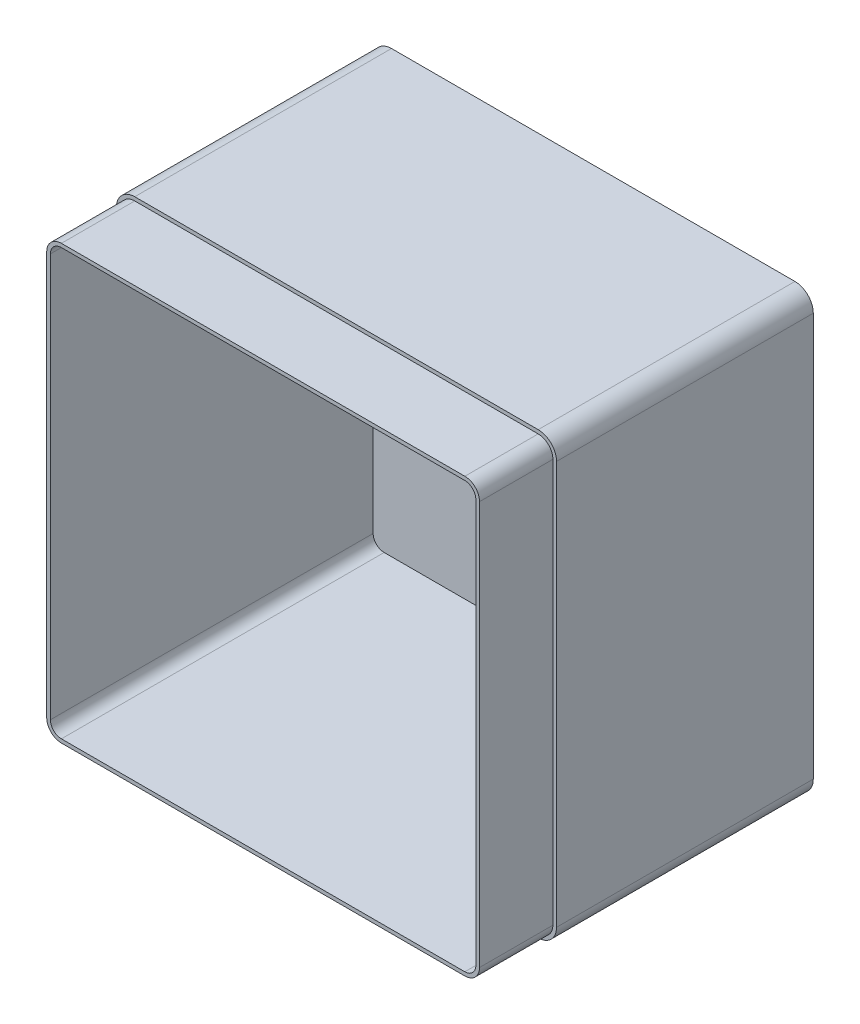
ISO-10303-21;
HEADER;
FILE_DESCRIPTION(('STEP AP214'),'2;1');
FILE_NAME('part.step','',(''),(''),'','','');
FILE_SCHEMA(('AUTOMOTIVE_DESIGN { 1 0 10303 214 1 1 1 1 }'));
ENDSEC;
DATA;
#1=APPLICATION_CONTEXT('core data for automotive mechanical design processes');
#2=APPLICATION_PROTOCOL_DEFINITION('international standard','automotive_design',2000,#1);
#3=PRODUCT_CONTEXT('',#1,'mechanical');
#4=PRODUCT('Part','Part','',(#3));
#5=PRODUCT_RELATED_PRODUCT_CATEGORY('part','',(#4));
#6=PRODUCT_DEFINITION_FORMATION('','',#4);
#7=PRODUCT_DEFINITION_CONTEXT('part definition',#1,'design');
#8=PRODUCT_DEFINITION('design','',#6,#7);
#9=PRODUCT_DEFINITION_SHAPE('','',#8);
#10=(LENGTH_UNIT() NAMED_UNIT(*) SI_UNIT(.MILLI.,.METRE.));
#11=(NAMED_UNIT(*) PLANE_ANGLE_UNIT() SI_UNIT($,.RADIAN.));
#12=(NAMED_UNIT(*) SI_UNIT($,.STERADIAN.) SOLID_ANGLE_UNIT());
#13=UNCERTAINTY_MEASURE_WITH_UNIT(LENGTH_MEASURE(1.E-05),#10,'distance_accuracy_value','');
#14=(GEOMETRIC_REPRESENTATION_CONTEXT(3) GLOBAL_UNCERTAINTY_ASSIGNED_CONTEXT((#13)) GLOBAL_UNIT_ASSIGNED_CONTEXT((#10,
#11,#12)) REPRESENTATION_CONTEXT('',''));
#15=CARTESIAN_POINT('',(0.,0.,0.));
#16=DIRECTION('',(0.,0.,1.));
#17=DIRECTION('',(1.,0.,0.));
#18=AXIS2_PLACEMENT_3D('',#15,#16,#17);
#19=CARTESIAN_POINT('',(0.,0.,90.));
#20=DIRECTION('',(0.,0.,-1.));
#21=DIRECTION('',(-1.,0.,0.));
#22=AXIS2_PLACEMENT_3D('',#19,#20,#21);
#23=PLANE('',#22);
#24=DIRECTION('',(0.,-1.,0.));
#25=VECTOR('',#24,1.);
#26=CARTESIAN_POINT('',(2.,0.,90.));
#27=LINE('',#26,#25);
#28=CARTESIAN_POINT('',(2.,115.,90.));
#29=VERTEX_POINT('',#28);
#30=CARTESIAN_POINT('',(2.,5.,90.));
#31=VERTEX_POINT('',#30);
#32=EDGE_CURVE('E361',#29,#31,#27,.T.);
#33=ORIENTED_EDGE('',*,*,#32,.F.);
#34=CARTESIAN_POINT('',(5.,115.,90.));
#35=DIRECTION('',(0.,0.,-1.));
#36=DIRECTION('',(-1.,0.,0.));
#37=AXIS2_PLACEMENT_3D('',#34,#35,#36);
#38=CIRCLE('',#37,3.);
#39=CARTESIAN_POINT('',(5.,118.,90.));
#40=VERTEX_POINT('',#39);
#41=EDGE_CURVE('E407',#40,#29,#38,.F.);
#42=ORIENTED_EDGE('',*,*,#41,.F.);
#43=DIRECTION('',(-1.,0.,0.));
#44=VECTOR('',#43,1.);
#45=CARTESIAN_POINT('',(0.,118.,90.));
#46=LINE('',#45,#44);
#47=CARTESIAN_POINT('',(115.,118.,90.));
#48=VERTEX_POINT('',#47);
#49=EDGE_CURVE('E376',#48,#40,#46,.T.);
#50=ORIENTED_EDGE('',*,*,#49,.F.);
#51=CARTESIAN_POINT('',(115.,115.,90.));
#52=DIRECTION('',(0.,0.,-1.));
#53=DIRECTION('',(-1.,0.,0.));
#54=AXIS2_PLACEMENT_3D('',#51,#52,#53);
#55=CIRCLE('',#54,3.);
#56=CARTESIAN_POINT('',(118.,115.,90.));
#57=VERTEX_POINT('',#56);
#58=EDGE_CURVE('E340',#57,#48,#55,.F.);
#59=ORIENTED_EDGE('',*,*,#58,.F.);
#60=DIRECTION('',(0.,1.,0.));
#61=VECTOR('',#60,1.);
#62=CARTESIAN_POINT('',(118.,0.,90.));
#63=LINE('',#62,#61);
#64=CARTESIAN_POINT('',(118.,4.99999999999999,90.));
#65=VERTEX_POINT('',#64);
#66=EDGE_CURVE('E404',#65,#57,#63,.T.);
#67=ORIENTED_EDGE('',*,*,#66,.F.);
#68=CARTESIAN_POINT('',(115.,5.,90.));
#69=DIRECTION('',(0.,0.,-1.));
#70=DIRECTION('',(-1.,0.,0.));
#71=AXIS2_PLACEMENT_3D('',#68,#69,#70);
#72=CIRCLE('',#71,3.);
#73=CARTESIAN_POINT('',(115.,2.,90.));
#74=VERTEX_POINT('',#73);
#75=EDGE_CURVE('E400',#74,#65,#72,.F.);
#76=ORIENTED_EDGE('',*,*,#75,.F.);
#77=DIRECTION('',(1.,0.,0.));
#78=VECTOR('',#77,1.);
#79=CARTESIAN_POINT('',(0.,2.,90.));
#80=LINE('',#79,#78);
#81=CARTESIAN_POINT('',(5.,2.,90.));
#82=VERTEX_POINT('',#81);
#83=EDGE_CURVE('E397',#82,#74,#80,.T.);
#84=ORIENTED_EDGE('',*,*,#83,.F.);
#85=CARTESIAN_POINT('',(5.,5.,90.));
#86=DIRECTION('',(0.,0.,-1.));
#87=DIRECTION('',(-1.,0.,0.));
#88=AXIS2_PLACEMENT_3D('',#85,#86,#87);
#89=CIRCLE('',#88,3.);
#90=EDGE_CURVE('E385',#31,#82,#89,.F.);
#91=ORIENTED_EDGE('',*,*,#90,.F.);
#92=EDGE_LOOP('',(#33,#42,#50,#59,#67,#76,#84,#91));
#93=FACE_BOUND('',#92,.T.);
#94=CARTESIAN_POINT('',(5.,115.,90.));
#95=DIRECTION('',(0.,0.,1.));
#96=DIRECTION('',(1.,0.,0.));
#97=AXIS2_PLACEMENT_3D('',#94,#95,#96);
#98=CIRCLE('',#97,4.);
#99=CARTESIAN_POINT('',(5.,119.,90.));
#100=VERTEX_POINT('',#99);
#101=CARTESIAN_POINT('',(1.,115.,90.));
#102=VERTEX_POINT('',#101);
#103=EDGE_CURVE('E268',#100,#102,#98,.T.);
#104=ORIENTED_EDGE('',*,*,#103,.T.);
#105=DIRECTION('',(0.,-1.,0.));
#106=VECTOR('',#105,1.);
#107=CARTESIAN_POINT('',(1.,115.,90.));
#108=LINE('',#107,#106);
#109=CARTESIAN_POINT('',(1.,4.99999999999999,90.));
#110=VERTEX_POINT('',#109);
#111=EDGE_CURVE('E218',#102,#110,#108,.T.);
#112=ORIENTED_EDGE('',*,*,#111,.T.);
#113=CARTESIAN_POINT('',(5.,5.,90.));
#114=DIRECTION('',(0.,0.,1.));
#115=DIRECTION('',(1.,0.,0.));
#116=AXIS2_PLACEMENT_3D('',#113,#114,#115);
#117=CIRCLE('',#116,4.);
#118=CARTESIAN_POINT('',(5.,1.,90.));
#119=VERTEX_POINT('',#118);
#120=EDGE_CURVE('E66',#110,#119,#117,.T.);
#121=ORIENTED_EDGE('',*,*,#120,.T.);
#122=DIRECTION('',(1.,0.,0.));
#123=VECTOR('',#122,1.);
#124=CARTESIAN_POINT('',(5.,1.,90.));
#125=LINE('',#124,#123);
#126=CARTESIAN_POINT('',(115.,1.,90.));
#127=VERTEX_POINT('',#126);
#128=EDGE_CURVE('E275',#119,#127,#125,.T.);
#129=ORIENTED_EDGE('',*,*,#128,.T.);
#130=CARTESIAN_POINT('',(115.,5.,90.));
#131=DIRECTION('',(0.,0.,1.));
#132=DIRECTION('',(1.,0.,0.));
#133=AXIS2_PLACEMENT_3D('',#130,#131,#132);
#134=CIRCLE('',#133,4.);
#135=CARTESIAN_POINT('',(119.,5.,90.));
#136=VERTEX_POINT('',#135);
#137=EDGE_CURVE('E279',#127,#136,#134,.T.);
#138=ORIENTED_EDGE('',*,*,#137,.T.);
#139=DIRECTION('',(0.,1.,0.));
#140=VECTOR('',#139,1.);
#141=CARTESIAN_POINT('',(119.,5.,90.));
#142=LINE('',#141,#140);
#143=CARTESIAN_POINT('',(119.,115.,90.));
#144=VERTEX_POINT('',#143);
#145=EDGE_CURVE('E283',#136,#144,#142,.T.);
#146=ORIENTED_EDGE('',*,*,#145,.T.);
#147=CARTESIAN_POINT('',(115.,115.,90.));
#148=DIRECTION('',(0.,0.,1.));
#149=DIRECTION('',(1.,0.,0.));
#150=AXIS2_PLACEMENT_3D('',#147,#148,#149);
#151=CIRCLE('',#150,4.);
#152=CARTESIAN_POINT('',(115.,119.,90.));
#153=VERTEX_POINT('',#152);
#154=EDGE_CURVE('E245',#144,#153,#151,.T.);
#155=ORIENTED_EDGE('',*,*,#154,.T.);
#156=DIRECTION('',(-1.,0.,0.));
#157=VECTOR('',#156,1.);
#158=CARTESIAN_POINT('',(115.,119.,90.));
#159=LINE('',#158,#157);
#160=EDGE_CURVE('E241',#153,#100,#159,.T.);
#161=ORIENTED_EDGE('',*,*,#160,.T.);
#162=EDGE_LOOP('',(#104,#112,#121,#129,#138,#146,#155,#161));
#163=FACE_BOUND('',#162,.T.);
#164=ADVANCED_FACE('F50',(#93,#163),#23,.F.);
#165=CARTESIAN_POINT('',(2.,0.,90.));
#166=DIRECTION('',(1.,0.,0.));
#167=DIRECTION('',(0.,0.,-1.));
#168=AXIS2_PLACEMENT_3D('',#165,#166,#167);
#169=PLANE('',#168);
#170=DIRECTION('',(0.,-1.,0.));
#171=VECTOR('',#170,1.);
#172=CARTESIAN_POINT('',(2.,0.,2.));
#173=LINE('',#172,#171);
#174=CARTESIAN_POINT('',(2.,115.,2.));
#175=VERTEX_POINT('',#174);
#176=CARTESIAN_POINT('',(2.,5.,2.));
#177=VERTEX_POINT('',#176);
#178=EDGE_CURVE('E332',#175,#177,#173,.T.);
#179=ORIENTED_EDGE('',*,*,#178,.F.);
#180=DIRECTION('',(0.,0.,-1.));
#181=VECTOR('',#180,1.);
#182=CARTESIAN_POINT('',(2.,115.,90.));
#183=LINE('',#182,#181);
#184=EDGE_CURVE('E341',#29,#175,#183,.T.);
#185=ORIENTED_EDGE('',*,*,#184,.F.);
#186=ORIENTED_EDGE('',*,*,#32,.T.);
#187=DIRECTION('',(0.,0.,-1.));
#188=VECTOR('',#187,1.);
#189=CARTESIAN_POINT('',(2.,5.,90.));
#190=LINE('',#189,#188);
#191=EDGE_CURVE('E337',#177,#31,#190,.F.);
#192=ORIENTED_EDGE('',*,*,#191,.F.);
#193=EDGE_LOOP('',(#179,#185,#186,#192));
#194=FACE_BOUND('',#193,.T.);
#195=ADVANCED_FACE('F515',(#194),#169,.T.);
#196=CARTESIAN_POINT('',(0.,2.,90.));
#197=DIRECTION('',(0.,1.,0.));
#198=DIRECTION('',(0.,0.,1.));
#199=AXIS2_PLACEMENT_3D('',#196,#197,#198);
#200=PLANE('',#199);
#201=ORIENTED_EDGE('',*,*,#83,.T.);
#202=DIRECTION('',(0.,0.,1.));
#203=VECTOR('',#202,1.);
#204=CARTESIAN_POINT('',(115.,2.,90.));
#205=LINE('',#204,#203);
#206=CARTESIAN_POINT('',(115.,2.,2.));
#207=VERTEX_POINT('',#206);
#208=EDGE_CURVE('E373',#207,#74,#205,.T.);
#209=ORIENTED_EDGE('',*,*,#208,.F.);
#210=DIRECTION('',(1.,0.,0.));
#211=VECTOR('',#210,1.);
#212=CARTESIAN_POINT('',(0.,2.,2.));
#213=LINE('',#212,#211);
#214=CARTESIAN_POINT('',(5.,2.,2.));
#215=VERTEX_POINT('',#214);
#216=EDGE_CURVE('E336',#215,#207,#213,.T.);
#217=ORIENTED_EDGE('',*,*,#216,.F.);
#218=DIRECTION('',(0.,0.,1.));
#219=VECTOR('',#218,1.);
#220=CARTESIAN_POINT('',(5.,2.,90.));
#221=LINE('',#220,#219);
#222=EDGE_CURVE('E364',#82,#215,#221,.F.);
#223=ORIENTED_EDGE('',*,*,#222,.F.);
#224=EDGE_LOOP('',(#201,#209,#217,#223));
#225=FACE_BOUND('',#224,.T.);
#226=ADVANCED_FACE('F521',(#225),#200,.T.);
#227=CARTESIAN_POINT('',(118.,0.,90.));
#228=DIRECTION('',(-1.,0.,0.));
#229=DIRECTION('',(0.,0.,1.));
#230=AXIS2_PLACEMENT_3D('',#227,#228,#229);
#231=PLANE('',#230);
#232=ORIENTED_EDGE('',*,*,#66,.T.);
#233=DIRECTION('',(0.,0.,1.));
#234=VECTOR('',#233,1.);
#235=CARTESIAN_POINT('',(118.,115.,90.));
#236=LINE('',#235,#234);
#237=CARTESIAN_POINT('',(118.,115.,2.));
#238=VERTEX_POINT('',#237);
#239=EDGE_CURVE('E382',#238,#57,#236,.T.);
#240=ORIENTED_EDGE('',*,*,#239,.F.);
#241=DIRECTION('',(0.,1.,0.));
#242=VECTOR('',#241,1.);
#243=CARTESIAN_POINT('',(118.,0.,2.));
#244=LINE('',#243,#242);
#245=CARTESIAN_POINT('',(118.,4.99999999999999,2.));
#246=VERTEX_POINT('',#245);
#247=EDGE_CURVE('E349',#246,#238,#244,.T.);
#248=ORIENTED_EDGE('',*,*,#247,.F.);
#249=DIRECTION('',(0.,0.,1.));
#250=VECTOR('',#249,1.);
#251=CARTESIAN_POINT('',(118.,4.99999999999999,90.));
#252=LINE('',#251,#250);
#253=EDGE_CURVE('E377',#65,#246,#252,.F.);
#254=ORIENTED_EDGE('',*,*,#253,.F.);
#255=EDGE_LOOP('',(#232,#240,#248,#254));
#256=FACE_BOUND('',#255,.T.);
#257=ADVANCED_FACE('F737',(#256),#231,.T.);
#258=CARTESIAN_POINT('',(0.,118.,90.));
#259=DIRECTION('',(0.,-1.,0.));
#260=DIRECTION('',(0.,0.,-1.));
#261=AXIS2_PLACEMENT_3D('',#258,#259,#260);
#262=PLANE('',#261);
#263=DIRECTION('',(-1.,0.,0.));
#264=VECTOR('',#263,1.);
#265=CARTESIAN_POINT('',(0.,118.,2.));
#266=LINE('',#265,#264);
#267=CARTESIAN_POINT('',(115.,118.,2.));
#268=VERTEX_POINT('',#267);
#269=CARTESIAN_POINT('',(5.,118.,2.));
#270=VERTEX_POINT('',#269);
#271=EDGE_CURVE('E357',#268,#270,#266,.T.);
#272=ORIENTED_EDGE('',*,*,#271,.F.);
#273=DIRECTION('',(0.,0.,-1.));
#274=VECTOR('',#273,1.);
#275=CARTESIAN_POINT('',(115.,118.,90.));
#276=LINE('',#275,#274);
#277=EDGE_CURVE('E381',#48,#268,#276,.T.);
#278=ORIENTED_EDGE('',*,*,#277,.F.);
#279=ORIENTED_EDGE('',*,*,#49,.T.);
#280=DIRECTION('',(0.,0.,-1.));
#281=VECTOR('',#280,1.);
#282=CARTESIAN_POINT('',(5.,118.,90.));
#283=LINE('',#282,#281);
#284=EDGE_CURVE('E389',#270,#40,#283,.F.);
#285=ORIENTED_EDGE('',*,*,#284,.F.);
#286=EDGE_LOOP('',(#272,#278,#279,#285));
#287=FACE_BOUND('',#286,.T.);
#288=ADVANCED_FACE('F729',(#287),#262,.T.);
#289=CARTESIAN_POINT('',(0.,0.,2.));
#290=DIRECTION('',(0.,0.,-1.));
#291=DIRECTION('',(-1.,0.,0.));
#292=AXIS2_PLACEMENT_3D('',#289,#290,#291);
#293=PLANE('',#292);
#294=ORIENTED_EDGE('',*,*,#216,.T.);
#295=CARTESIAN_POINT('',(115.,5.,2.));
#296=DIRECTION('',(0.,0.,-1.));
#297=DIRECTION('',(-1.,0.,0.));
#298=AXIS2_PLACEMENT_3D('',#295,#296,#297);
#299=CIRCLE('',#298,3.);
#300=EDGE_CURVE('E352',#246,#207,#299,.T.);
#301=ORIENTED_EDGE('',*,*,#300,.F.);
#302=ORIENTED_EDGE('',*,*,#247,.T.);
#303=CARTESIAN_POINT('',(115.,115.,2.));
#304=DIRECTION('',(0.,0.,-1.));
#305=DIRECTION('',(-1.,0.,0.));
#306=AXIS2_PLACEMENT_3D('',#303,#304,#305);
#307=CIRCLE('',#306,3.);
#308=EDGE_CURVE('E356',#268,#238,#307,.T.);
#309=ORIENTED_EDGE('',*,*,#308,.F.);
#310=ORIENTED_EDGE('',*,*,#271,.T.);
#311=CARTESIAN_POINT('',(5.,115.,2.));
#312=DIRECTION('',(0.,0.,-1.));
#313=DIRECTION('',(-1.,0.,0.));
#314=AXIS2_PLACEMENT_3D('',#311,#312,#313);
#315=CIRCLE('',#314,3.);
#316=EDGE_CURVE('E353',#175,#270,#315,.T.);
#317=ORIENTED_EDGE('',*,*,#316,.F.);
#318=ORIENTED_EDGE('',*,*,#178,.T.);
#319=CARTESIAN_POINT('',(5.,5.,2.));
#320=DIRECTION('',(0.,0.,-1.));
#321=DIRECTION('',(-1.,0.,0.));
#322=AXIS2_PLACEMENT_3D('',#319,#320,#321);
#323=CIRCLE('',#322,3.);
#324=EDGE_CURVE('E345',#215,#177,#323,.T.);
#325=ORIENTED_EDGE('',*,*,#324,.F.);
#326=EDGE_LOOP('',(#294,#301,#302,#309,#310,#317,#318,#325));
#327=FACE_BOUND('',#326,.T.);
#328=ADVANCED_FACE('F721',(#327),#293,.F.);
#329=CARTESIAN_POINT('',(5.,5.,90.));
#330=DIRECTION('',(0.,0.,-1.));
#331=DIRECTION('',(-1.,0.,0.));
#332=AXIS2_PLACEMENT_3D('',#329,#330,#331);
#333=CYLINDRICAL_SURFACE('',#332,3.);
#334=ORIENTED_EDGE('',*,*,#90,.T.);
#335=ORIENTED_EDGE('',*,*,#222,.T.);
#336=ORIENTED_EDGE('',*,*,#324,.T.);
#337=ORIENTED_EDGE('',*,*,#191,.T.);
#338=EDGE_LOOP('',(#334,#335,#336,#337));
#339=FACE_BOUND('',#338,.T.);
#340=ADVANCED_FACE('F713',(#339),#333,.F.);
#341=CARTESIAN_POINT('',(115.,5.,90.));
#342=DIRECTION('',(0.,0.,-1.));
#343=DIRECTION('',(-1.,0.,0.));
#344=AXIS2_PLACEMENT_3D('',#341,#342,#343);
#345=CYLINDRICAL_SURFACE('',#344,3.);
#346=ORIENTED_EDGE('',*,*,#75,.T.);
#347=ORIENTED_EDGE('',*,*,#253,.T.);
#348=ORIENTED_EDGE('',*,*,#300,.T.);
#349=ORIENTED_EDGE('',*,*,#208,.T.);
#350=EDGE_LOOP('',(#346,#347,#348,#349));
#351=FACE_BOUND('',#350,.T.);
#352=ADVANCED_FACE('F706',(#351),#345,.F.);
#353=CARTESIAN_POINT('',(5.,115.,90.));
#354=DIRECTION('',(0.,0.,-1.));
#355=DIRECTION('',(-1.,0.,0.));
#356=AXIS2_PLACEMENT_3D('',#353,#354,#355);
#357=CYLINDRICAL_SURFACE('',#356,3.);
#358=ORIENTED_EDGE('',*,*,#41,.T.);
#359=ORIENTED_EDGE('',*,*,#184,.T.);
#360=ORIENTED_EDGE('',*,*,#316,.T.);
#361=ORIENTED_EDGE('',*,*,#284,.T.);
#362=EDGE_LOOP('',(#358,#359,#360,#361));
#363=FACE_BOUND('',#362,.T.);
#364=ADVANCED_FACE('F702',(#363),#357,.F.);
#365=CARTESIAN_POINT('',(115.,115.,90.));
#366=DIRECTION('',(0.,0.,-1.));
#367=DIRECTION('',(-1.,0.,0.));
#368=AXIS2_PLACEMENT_3D('',#365,#366,#367);
#369=CYLINDRICAL_SURFACE('',#368,3.);
#370=ORIENTED_EDGE('',*,*,#58,.T.);
#371=ORIENTED_EDGE('',*,*,#277,.T.);
#372=ORIENTED_EDGE('',*,*,#308,.T.);
#373=ORIENTED_EDGE('',*,*,#239,.T.);
#374=EDGE_LOOP('',(#370,#371,#372,#373));
#375=FACE_BOUND('',#374,.T.);
#376=ADVANCED_FACE('F528',(#375),#369,.F.);
#377=CARTESIAN_POINT('',(5.,115.,70.));
#378=DIRECTION('',(0.,0.,1.));
#379=DIRECTION('',(1.,0.,0.));
#380=AXIS2_PLACEMENT_3D('',#377,#378,#379);
#381=PLANE('',#380);
#382=DIRECTION('',(-1.,0.,0.));
#383=VECTOR('',#382,1.);
#384=CARTESIAN_POINT('',(115.,119.,70.));
#385=LINE('',#384,#383);
#386=CARTESIAN_POINT('',(115.,119.,70.));
#387=VERTEX_POINT('',#386);
#388=CARTESIAN_POINT('',(5.,119.,70.));
#389=VERTEX_POINT('',#388);
#390=EDGE_CURVE('E225',#387,#389,#385,.T.);
#391=ORIENTED_EDGE('',*,*,#390,.F.);
#392=CARTESIAN_POINT('',(115.,115.,70.));
#393=DIRECTION('',(0.,0.,1.));
#394=DIRECTION('',(1.,0.,0.));
#395=AXIS2_PLACEMENT_3D('',#392,#393,#394);
#396=CIRCLE('',#395,4.);
#397=CARTESIAN_POINT('',(119.,115.,70.));
#398=VERTEX_POINT('',#397);
#399=EDGE_CURVE('E262',#398,#387,#396,.T.);
#400=ORIENTED_EDGE('',*,*,#399,.F.);
#401=DIRECTION('',(0.,1.,0.));
#402=VECTOR('',#401,1.);
#403=CARTESIAN_POINT('',(119.,5.,70.));
#404=LINE('',#403,#402);
#405=CARTESIAN_POINT('',(119.,5.,70.));
#406=VERTEX_POINT('',#405);
#407=EDGE_CURVE('E258',#406,#398,#404,.T.);
#408=ORIENTED_EDGE('',*,*,#407,.F.);
#409=CARTESIAN_POINT('',(115.,5.,70.));
#410=DIRECTION('',(0.,0.,1.));
#411=DIRECTION('',(1.,0.,0.));
#412=AXIS2_PLACEMENT_3D('',#409,#410,#411);
#413=CIRCLE('',#412,4.);
#414=CARTESIAN_POINT('',(115.,1.,70.));
#415=VERTEX_POINT('',#414);
#416=EDGE_CURVE('E254',#415,#406,#413,.T.);
#417=ORIENTED_EDGE('',*,*,#416,.F.);
#418=DIRECTION('',(1.,0.,0.));
#419=VECTOR('',#418,1.);
#420=CARTESIAN_POINT('',(5.,1.,70.));
#421=LINE('',#420,#419);
#422=CARTESIAN_POINT('',(5.,1.,70.));
#423=VERTEX_POINT('',#422);
#424=EDGE_CURVE('E250',#423,#415,#421,.T.);
#425=ORIENTED_EDGE('',*,*,#424,.F.);
#426=CARTESIAN_POINT('',(5.,5.,70.));
#427=DIRECTION('',(0.,0.,1.));
#428=DIRECTION('',(1.,0.,0.));
#429=AXIS2_PLACEMENT_3D('',#426,#427,#428);
#430=CIRCLE('',#429,4.);
#431=CARTESIAN_POINT('',(1.,4.99999999999999,70.));
#432=VERTEX_POINT('',#431);
#433=EDGE_CURVE('E235',#432,#423,#430,.T.);
#434=ORIENTED_EDGE('',*,*,#433,.F.);
#435=DIRECTION('',(0.,-1.,0.));
#436=VECTOR('',#435,1.);
#437=CARTESIAN_POINT('',(1.,115.,70.));
#438=LINE('',#437,#436);
#439=CARTESIAN_POINT('',(1.,115.,70.));
#440=VERTEX_POINT('',#439);
#441=EDGE_CURVE('E216',#440,#432,#438,.T.);
#442=ORIENTED_EDGE('',*,*,#441,.F.);
#443=CARTESIAN_POINT('',(5.,115.,70.));
#444=DIRECTION('',(0.,0.,1.));
#445=DIRECTION('',(1.,0.,0.));
#446=AXIS2_PLACEMENT_3D('',#443,#444,#445);
#447=CIRCLE('',#446,4.);
#448=EDGE_CURVE('E231',#389,#440,#447,.T.);
#449=ORIENTED_EDGE('',*,*,#448,.F.);
#450=EDGE_LOOP('',(#391,#400,#408,#417,#425,#434,#442,#449));
#451=FACE_BOUND('',#450,.T.);
#452=CARTESIAN_POINT('',(5.,115.,70.));
#453=DIRECTION('',(0.,0.,1.));
#454=DIRECTION('',(1.,0.,0.));
#455=AXIS2_PLACEMENT_3D('',#452,#453,#454);
#456=CIRCLE('',#455,5.);
#457=CARTESIAN_POINT('',(5.,120.,70.));
#458=VERTEX_POINT('',#457);
#459=CARTESIAN_POINT('',(0.,115.,70.));
#460=VERTEX_POINT('',#459);
#461=EDGE_CURVE('E292',#458,#460,#456,.T.);
#462=ORIENTED_EDGE('',*,*,#461,.T.);
#463=DIRECTION('',(0.,-1.,0.));
#464=VECTOR('',#463,1.);
#465=CARTESIAN_POINT('',(0.,115.,70.));
#466=LINE('',#465,#464);
#467=CARTESIAN_POINT('',(0.,5.,70.));
#468=VERTEX_POINT('',#467);
#469=EDGE_CURVE('E312',#460,#468,#466,.T.);
#470=ORIENTED_EDGE('',*,*,#469,.T.);
#471=CARTESIAN_POINT('',(5.,5.,70.));
#472=DIRECTION('',(0.,0.,1.));
#473=DIRECTION('',(1.,0.,0.));
#474=AXIS2_PLACEMENT_3D('',#471,#472,#473);
#475=CIRCLE('',#474,5.);
#476=CARTESIAN_POINT('',(5.,0.,70.));
#477=VERTEX_POINT('',#476);
#478=EDGE_CURVE('E315',#468,#477,#475,.T.);
#479=ORIENTED_EDGE('',*,*,#478,.T.);
#480=DIRECTION('',(1.,0.,0.));
#481=VECTOR('',#480,1.);
#482=CARTESIAN_POINT('',(5.,0.,70.));
#483=LINE('',#482,#481);
#484=CARTESIAN_POINT('',(115.,0.,70.));
#485=VERTEX_POINT('',#484);
#486=EDGE_CURVE('E318',#477,#485,#483,.T.);
#487=ORIENTED_EDGE('',*,*,#486,.T.);
#488=CARTESIAN_POINT('',(115.,5.,70.));
#489=DIRECTION('',(0.,0.,1.));
#490=DIRECTION('',(1.,0.,0.));
#491=AXIS2_PLACEMENT_3D('',#488,#489,#490);
#492=CIRCLE('',#491,5.);
#493=CARTESIAN_POINT('',(120.,5.,70.));
#494=VERTEX_POINT('',#493);
#495=EDGE_CURVE('E321',#485,#494,#492,.T.);
#496=ORIENTED_EDGE('',*,*,#495,.T.);
#497=DIRECTION('',(0.,1.,0.));
#498=VECTOR('',#497,1.);
#499=CARTESIAN_POINT('',(120.,5.,70.));
#500=LINE('',#499,#498);
#501=CARTESIAN_POINT('',(120.,115.,70.));
#502=VERTEX_POINT('',#501);
#503=EDGE_CURVE('E74',#494,#502,#500,.T.);
#504=ORIENTED_EDGE('',*,*,#503,.T.);
#505=CARTESIAN_POINT('',(115.,115.,70.));
#506=DIRECTION('',(0.,0.,1.));
#507=DIRECTION('',(1.,0.,0.));
#508=AXIS2_PLACEMENT_3D('',#505,#506,#507);
#509=CIRCLE('',#508,5.);
#510=CARTESIAN_POINT('',(115.,120.,70.));
#511=VERTEX_POINT('',#510);
#512=EDGE_CURVE('E326',#502,#511,#509,.T.);
#513=ORIENTED_EDGE('',*,*,#512,.T.);
#514=DIRECTION('',(-1.,0.,0.));
#515=VECTOR('',#514,1.);
#516=CARTESIAN_POINT('',(115.,120.,70.));
#517=LINE('',#516,#515);
#518=EDGE_CURVE('E329',#511,#458,#517,.T.);
#519=ORIENTED_EDGE('',*,*,#518,.T.);
#520=EDGE_LOOP('',(#462,#470,#479,#487,#496,#504,#513,#519));
#521=FACE_BOUND('',#520,.T.);
#522=ADVANCED_FACE('F230',(#451,#521),#381,.T.);
#523=CARTESIAN_POINT('',(5.,115.,70.));
#524=DIRECTION('',(0.,0.,1.));
#525=DIRECTION('',(1.,0.,0.));
#526=AXIS2_PLACEMENT_3D('',#523,#524,#525);
#527=CYLINDRICAL_SURFACE('',#526,4.);
#528=ORIENTED_EDGE('',*,*,#103,.F.);
#529=DIRECTION('',(0.,0.,1.));
#530=VECTOR('',#529,1.);
#531=CARTESIAN_POINT('',(5.,119.,70.));
#532=LINE('',#531,#530);
#533=EDGE_CURVE('E239',#389,#100,#532,.T.);
#534=ORIENTED_EDGE('',*,*,#533,.F.);
#535=ORIENTED_EDGE('',*,*,#448,.T.);
#536=DIRECTION('',(0.,0.,1.));
#537=VECTOR('',#536,1.);
#538=CARTESIAN_POINT('',(1.,115.,70.));
#539=LINE('',#538,#537);
#540=EDGE_CURVE('E213',#440,#102,#539,.T.);
#541=ORIENTED_EDGE('',*,*,#540,.T.);
#542=EDGE_LOOP('',(#528,#534,#535,#541));
#543=FACE_BOUND('',#542,.T.);
#544=ADVANCED_FACE('F238',(#543),#527,.T.);
#545=CARTESIAN_POINT('',(115.,119.,70.));
#546=DIRECTION('',(0.,1.,0.));
#547=DIRECTION('',(0.,0.,1.));
#548=AXIS2_PLACEMENT_3D('',#545,#546,#547);
#549=PLANE('',#548);
#550=ORIENTED_EDGE('',*,*,#160,.F.);
#551=DIRECTION('',(0.,0.,1.));
#552=VECTOR('',#551,1.);
#553=CARTESIAN_POINT('',(115.,119.,70.));
#554=LINE('',#553,#552);
#555=EDGE_CURVE('E293',#387,#153,#554,.T.);
#556=ORIENTED_EDGE('',*,*,#555,.F.);
#557=ORIENTED_EDGE('',*,*,#390,.T.);
#558=ORIENTED_EDGE('',*,*,#533,.T.);
#559=EDGE_LOOP('',(#550,#556,#557,#558));
#560=FACE_BOUND('',#559,.T.);
#561=ADVANCED_FACE('F573',(#560),#549,.T.);
#562=CARTESIAN_POINT('',(115.,115.,70.));
#563=DIRECTION('',(0.,0.,1.));
#564=DIRECTION('',(1.,0.,0.));
#565=AXIS2_PLACEMENT_3D('',#562,#563,#564);
#566=CYLINDRICAL_SURFACE('',#565,4.);
#567=ORIENTED_EDGE('',*,*,#154,.F.);
#568=DIRECTION('',(0.,0.,1.));
#569=VECTOR('',#568,1.);
#570=CARTESIAN_POINT('',(119.,115.,70.));
#571=LINE('',#570,#569);
#572=EDGE_CURVE('E296',#398,#144,#571,.T.);
#573=ORIENTED_EDGE('',*,*,#572,.F.);
#574=ORIENTED_EDGE('',*,*,#399,.T.);
#575=ORIENTED_EDGE('',*,*,#555,.T.);
#576=EDGE_LOOP('',(#567,#573,#574,#575));
#577=FACE_BOUND('',#576,.T.);
#578=ADVANCED_FACE('F582',(#577),#566,.T.);
#579=CARTESIAN_POINT('',(119.,5.,70.));
#580=DIRECTION('',(1.,0.,0.));
#581=DIRECTION('',(0.,0.,-1.));
#582=AXIS2_PLACEMENT_3D('',#579,#580,#581);
#583=PLANE('',#582);
#584=ORIENTED_EDGE('',*,*,#145,.F.);
#585=DIRECTION('',(0.,0.,1.));
#586=VECTOR('',#585,1.);
#587=CARTESIAN_POINT('',(119.,5.,70.));
#588=LINE('',#587,#586);
#589=EDGE_CURVE('E299',#406,#136,#588,.T.);
#590=ORIENTED_EDGE('',*,*,#589,.F.);
#591=ORIENTED_EDGE('',*,*,#407,.T.);
#592=ORIENTED_EDGE('',*,*,#572,.T.);
#593=EDGE_LOOP('',(#584,#590,#591,#592));
#594=FACE_BOUND('',#593,.T.);
#595=ADVANCED_FACE('F592',(#594),#583,.T.);
#596=CARTESIAN_POINT('',(115.,5.,70.));
#597=DIRECTION('',(0.,0.,1.));
#598=DIRECTION('',(1.,0.,0.));
#599=AXIS2_PLACEMENT_3D('',#596,#597,#598);
#600=CYLINDRICAL_SURFACE('',#599,4.);
#601=ORIENTED_EDGE('',*,*,#137,.F.);
#602=DIRECTION('',(0.,0.,1.));
#603=VECTOR('',#602,1.);
#604=CARTESIAN_POINT('',(115.,1.,70.));
#605=LINE('',#604,#603);
#606=EDGE_CURVE('E302',#415,#127,#605,.T.);
#607=ORIENTED_EDGE('',*,*,#606,.F.);
#608=ORIENTED_EDGE('',*,*,#416,.T.);
#609=ORIENTED_EDGE('',*,*,#589,.T.);
#610=EDGE_LOOP('',(#601,#607,#608,#609));
#611=FACE_BOUND('',#610,.T.);
#612=ADVANCED_FACE('F602',(#611),#600,.T.);
#613=CARTESIAN_POINT('',(5.,1.,70.));
#614=DIRECTION('',(0.,-1.,0.));
#615=DIRECTION('',(0.,0.,-1.));
#616=AXIS2_PLACEMENT_3D('',#613,#614,#615);
#617=PLANE('',#616);
#618=ORIENTED_EDGE('',*,*,#128,.F.);
#619=DIRECTION('',(0.,0.,1.));
#620=VECTOR('',#619,1.);
#621=CARTESIAN_POINT('',(5.,1.,70.));
#622=LINE('',#621,#620);
#623=EDGE_CURVE('E305',#423,#119,#622,.T.);
#624=ORIENTED_EDGE('',*,*,#623,.F.);
#625=ORIENTED_EDGE('',*,*,#424,.T.);
#626=ORIENTED_EDGE('',*,*,#606,.T.);
#627=EDGE_LOOP('',(#618,#624,#625,#626));
#628=FACE_BOUND('',#627,.T.);
#629=ADVANCED_FACE('F612',(#628),#617,.T.);
#630=CARTESIAN_POINT('',(5.,5.,70.));
#631=DIRECTION('',(0.,0.,1.));
#632=DIRECTION('',(1.,0.,0.));
#633=AXIS2_PLACEMENT_3D('',#630,#631,#632);
#634=CYLINDRICAL_SURFACE('',#633,4.);
#635=ORIENTED_EDGE('',*,*,#120,.F.);
#636=DIRECTION('',(0.,0.,1.));
#637=VECTOR('',#636,1.);
#638=CARTESIAN_POINT('',(1.,4.99999999999999,70.));
#639=LINE('',#638,#637);
#640=EDGE_CURVE('E224',#432,#110,#639,.T.);
#641=ORIENTED_EDGE('',*,*,#640,.F.);
#642=ORIENTED_EDGE('',*,*,#433,.T.);
#643=ORIENTED_EDGE('',*,*,#623,.T.);
#644=EDGE_LOOP('',(#635,#641,#642,#643));
#645=FACE_BOUND('',#644,.T.);
#646=ADVANCED_FACE('F622',(#645),#634,.T.);
#647=CARTESIAN_POINT('',(1.,115.,70.));
#648=DIRECTION('',(-1.,0.,0.));
#649=DIRECTION('',(0.,0.,1.));
#650=AXIS2_PLACEMENT_3D('',#647,#648,#649);
#651=PLANE('',#650);
#652=ORIENTED_EDGE('',*,*,#111,.F.);
#653=ORIENTED_EDGE('',*,*,#540,.F.);
#654=ORIENTED_EDGE('',*,*,#441,.T.);
#655=ORIENTED_EDGE('',*,*,#640,.T.);
#656=EDGE_LOOP('',(#652,#653,#654,#655));
#657=FACE_BOUND('',#656,.T.);
#658=ADVANCED_FACE('F215',(#657),#651,.T.);
#659=CARTESIAN_POINT('',(0.,0.,0.));
#660=DIRECTION('',(0.,0.,-1.));
#661=DIRECTION('',(-1.,0.,0.));
#662=AXIS2_PLACEMENT_3D('',#659,#660,#661);
#663=PLANE('',#662);
#664=DIRECTION('',(1.,0.,0.));
#665=VECTOR('',#664,1.);
#666=CARTESIAN_POINT('',(0.,0.,0.));
#667=LINE('',#666,#665);
#668=CARTESIAN_POINT('',(5.,0.,0.));
#669=VERTEX_POINT('',#668);
#670=CARTESIAN_POINT('',(115.,0.,0.));
#671=VERTEX_POINT('',#670);
#672=EDGE_CURVE('E420',#669,#671,#667,.T.);
#673=ORIENTED_EDGE('',*,*,#672,.F.);
#674=CARTESIAN_POINT('',(5.,5.,0.));
#675=DIRECTION('',(0.,0.,-1.));
#676=DIRECTION('',(-1.,0.,0.));
#677=AXIS2_PLACEMENT_3D('',#674,#675,#676);
#678=CIRCLE('',#677,5.);
#679=CARTESIAN_POINT('',(0.,5.,0.));
#680=VERTEX_POINT('',#679);
#681=EDGE_CURVE('E448',#669,#680,#678,.T.);
#682=ORIENTED_EDGE('',*,*,#681,.T.);
#683=DIRECTION('',(0.,-1.,0.));
#684=VECTOR('',#683,1.);
#685=CARTESIAN_POINT('',(0.,0.,0.));
#686=LINE('',#685,#684);
#687=CARTESIAN_POINT('',(0.,115.,0.));
#688=VERTEX_POINT('',#687);
#689=EDGE_CURVE('E393',#688,#680,#686,.T.);
#690=ORIENTED_EDGE('',*,*,#689,.F.);
#691=CARTESIAN_POINT('',(5.,115.,0.));
#692=DIRECTION('',(0.,0.,-1.));
#693=DIRECTION('',(-1.,0.,0.));
#694=AXIS2_PLACEMENT_3D('',#691,#692,#693);
#695=CIRCLE('',#694,5.);
#696=CARTESIAN_POINT('',(5.,120.,0.));
#697=VERTEX_POINT('',#696);
#698=EDGE_CURVE('E442',#688,#697,#695,.T.);
#699=ORIENTED_EDGE('',*,*,#698,.T.);
#700=DIRECTION('',(-1.,0.,0.));
#701=VECTOR('',#700,1.);
#702=CARTESIAN_POINT('',(0.,120.,0.));
#703=LINE('',#702,#701);
#704=CARTESIAN_POINT('',(115.,120.,0.));
#705=VERTEX_POINT('',#704);
#706=EDGE_CURVE('E428',#705,#697,#703,.T.);
#707=ORIENTED_EDGE('',*,*,#706,.F.);
#708=CARTESIAN_POINT('',(115.,115.,0.));
#709=DIRECTION('',(0.,0.,-1.));
#710=DIRECTION('',(-1.,0.,0.));
#711=AXIS2_PLACEMENT_3D('',#708,#709,#710);
#712=CIRCLE('',#711,5.);
#713=CARTESIAN_POINT('',(120.,115.,0.));
#714=VERTEX_POINT('',#713);
#715=EDGE_CURVE('E439',#705,#714,#712,.T.);
#716=ORIENTED_EDGE('',*,*,#715,.T.);
#717=DIRECTION('',(0.,1.,0.));
#718=VECTOR('',#717,1.);
#719=CARTESIAN_POINT('',(120.,0.,0.));
#720=LINE('',#719,#718);
#721=CARTESIAN_POINT('',(120.,5.,0.));
#722=VERTEX_POINT('',#721);
#723=EDGE_CURVE('E424',#722,#714,#720,.T.);
#724=ORIENTED_EDGE('',*,*,#723,.F.);
#725=CARTESIAN_POINT('',(115.,5.,0.));
#726=DIRECTION('',(0.,0.,-1.));
#727=DIRECTION('',(-1.,0.,0.));
#728=AXIS2_PLACEMENT_3D('',#725,#726,#727);
#729=CIRCLE('',#728,5.);
#730=EDGE_CURVE('E445',#722,#671,#729,.T.);
#731=ORIENTED_EDGE('',*,*,#730,.T.);
#732=EDGE_LOOP('',(#673,#682,#690,#699,#707,#716,#724,#731));
#733=FACE_BOUND('',#732,.T.);
#734=ADVANCED_FACE('F477',(#733),#663,.T.);
#735=CARTESIAN_POINT('',(5.,115.,90.));
#736=DIRECTION('',(0.,0.,-1.));
#737=DIRECTION('',(-1.,0.,0.));
#738=AXIS2_PLACEMENT_3D('',#735,#736,#737);
#739=CYLINDRICAL_SURFACE('',#738,5.);
#740=DIRECTION('',(0.,0.,-1.));
#741=VECTOR('',#740,1.);
#742=CARTESIAN_POINT('',(0.,115.,90.));
#743=LINE('',#742,#741);
#744=EDGE_CURVE('E451',#460,#688,#743,.T.);
#745=ORIENTED_EDGE('',*,*,#744,.F.);
#746=ORIENTED_EDGE('',*,*,#461,.F.);
#747=DIRECTION('',(0.,0.,-1.));
#748=VECTOR('',#747,1.);
#749=CARTESIAN_POINT('',(5.,120.,90.));
#750=LINE('',#749,#748);
#751=EDGE_CURVE('E12',#697,#458,#750,.F.);
#752=ORIENTED_EDGE('',*,*,#751,.F.);
#753=ORIENTED_EDGE('',*,*,#698,.F.);
#754=EDGE_LOOP('',(#745,#746,#752,#753));
#755=FACE_BOUND('',#754,.T.);
#756=ADVANCED_FACE('F482',(#755),#739,.T.);
#757=CARTESIAN_POINT('',(115.,115.,90.));
#758=DIRECTION('',(0.,0.,-1.));
#759=DIRECTION('',(-1.,0.,0.));
#760=AXIS2_PLACEMENT_3D('',#757,#758,#759);
#761=CYLINDRICAL_SURFACE('',#760,5.);
#762=DIRECTION('',(0.,0.,-1.));
#763=VECTOR('',#762,1.);
#764=CARTESIAN_POINT('',(115.,120.,90.));
#765=LINE('',#764,#763);
#766=EDGE_CURVE('E59',#511,#705,#765,.T.);
#767=ORIENTED_EDGE('',*,*,#766,.F.);
#768=ORIENTED_EDGE('',*,*,#512,.F.);
#769=DIRECTION('',(0.,0.,-1.));
#770=VECTOR('',#769,1.);
#771=CARTESIAN_POINT('',(120.,115.,90.));
#772=LINE('',#771,#770);
#773=EDGE_CURVE('E458',#714,#502,#772,.F.);
#774=ORIENTED_EDGE('',*,*,#773,.F.);
#775=ORIENTED_EDGE('',*,*,#715,.F.);
#776=EDGE_LOOP('',(#767,#768,#774,#775));
#777=FACE_BOUND('',#776,.T.);
#778=ADVANCED_FACE('F52',(#777),#761,.T.);
#779=CARTESIAN_POINT('',(0.,120.,90.));
#780=DIRECTION('',(0.,-1.,0.));
#781=DIRECTION('',(0.,0.,-1.));
#782=AXIS2_PLACEMENT_3D('',#779,#780,#781);
#783=PLANE('',#782);
#784=ORIENTED_EDGE('',*,*,#518,.F.);
#785=ORIENTED_EDGE('',*,*,#766,.T.);
#786=ORIENTED_EDGE('',*,*,#706,.T.);
#787=ORIENTED_EDGE('',*,*,#751,.T.);
#788=EDGE_LOOP('',(#784,#785,#786,#787));
#789=FACE_BOUND('',#788,.T.);
#790=ADVANCED_FACE('F469',(#789),#783,.F.);
#791=CARTESIAN_POINT('',(115.,5.,90.));
#792=DIRECTION('',(0.,0.,-1.));
#793=DIRECTION('',(-1.,0.,0.));
#794=AXIS2_PLACEMENT_3D('',#791,#792,#793);
#795=CYLINDRICAL_SURFACE('',#794,5.);
#796=DIRECTION('',(0.,0.,-1.));
#797=VECTOR('',#796,1.);
#798=CARTESIAN_POINT('',(120.,5.,90.));
#799=LINE('',#798,#797);
#800=EDGE_CURVE('E462',#494,#722,#799,.T.);
#801=ORIENTED_EDGE('',*,*,#800,.F.);
#802=ORIENTED_EDGE('',*,*,#495,.F.);
#803=DIRECTION('',(0.,0.,-1.));
#804=VECTOR('',#803,1.);
#805=CARTESIAN_POINT('',(115.,0.,90.));
#806=LINE('',#805,#804);
#807=EDGE_CURVE('E432',#671,#485,#806,.F.);
#808=ORIENTED_EDGE('',*,*,#807,.F.);
#809=ORIENTED_EDGE('',*,*,#730,.F.);
#810=EDGE_LOOP('',(#801,#802,#808,#809));
#811=FACE_BOUND('',#810,.T.);
#812=ADVANCED_FACE('F501',(#811),#795,.T.);
#813=CARTESIAN_POINT('',(120.,0.,90.));
#814=DIRECTION('',(-1.,0.,0.));
#815=DIRECTION('',(0.,0.,1.));
#816=AXIS2_PLACEMENT_3D('',#813,#814,#815);
#817=PLANE('',#816);
#818=ORIENTED_EDGE('',*,*,#503,.F.);
#819=ORIENTED_EDGE('',*,*,#800,.T.);
#820=ORIENTED_EDGE('',*,*,#723,.T.);
#821=ORIENTED_EDGE('',*,*,#773,.T.);
#822=EDGE_LOOP('',(#818,#819,#820,#821));
#823=FACE_BOUND('',#822,.T.);
#824=ADVANCED_FACE('F503',(#823),#817,.F.);
#825=CARTESIAN_POINT('',(5.,5.,90.));
#826=DIRECTION('',(0.,0.,-1.));
#827=DIRECTION('',(-1.,0.,0.));
#828=AXIS2_PLACEMENT_3D('',#825,#826,#827);
#829=CYLINDRICAL_SURFACE('',#828,5.);
#830=DIRECTION('',(0.,0.,-1.));
#831=VECTOR('',#830,1.);
#832=CARTESIAN_POINT('',(5.,0.,90.));
#833=LINE('',#832,#831);
#834=EDGE_CURVE('E436',#477,#669,#833,.T.);
#835=ORIENTED_EDGE('',*,*,#834,.F.);
#836=ORIENTED_EDGE('',*,*,#478,.F.);
#837=DIRECTION('',(0.,0.,-1.));
#838=VECTOR('',#837,1.);
#839=CARTESIAN_POINT('',(0.,5.,90.));
#840=LINE('',#839,#838);
#841=EDGE_CURVE('E454',#680,#468,#840,.F.);
#842=ORIENTED_EDGE('',*,*,#841,.F.);
#843=ORIENTED_EDGE('',*,*,#681,.F.);
#844=EDGE_LOOP('',(#835,#836,#842,#843));
#845=FACE_BOUND('',#844,.T.);
#846=ADVANCED_FACE('F492',(#845),#829,.T.);
#847=CARTESIAN_POINT('',(0.,0.,90.));
#848=DIRECTION('',(0.,1.,0.));
#849=DIRECTION('',(0.,0.,1.));
#850=AXIS2_PLACEMENT_3D('',#847,#848,#849);
#851=PLANE('',#850);
#852=ORIENTED_EDGE('',*,*,#486,.F.);
#853=ORIENTED_EDGE('',*,*,#834,.T.);
#854=ORIENTED_EDGE('',*,*,#672,.T.);
#855=ORIENTED_EDGE('',*,*,#807,.T.);
#856=EDGE_LOOP('',(#852,#853,#854,#855));
#857=FACE_BOUND('',#856,.T.);
#858=ADVANCED_FACE('F496',(#857),#851,.F.);
#859=CARTESIAN_POINT('',(0.,0.,90.));
#860=DIRECTION('',(1.,0.,0.));
#861=DIRECTION('',(0.,0.,-1.));
#862=AXIS2_PLACEMENT_3D('',#859,#860,#861);
#863=PLANE('',#862);
#864=ORIENTED_EDGE('',*,*,#469,.F.);
#865=ORIENTED_EDGE('',*,*,#744,.T.);
#866=ORIENTED_EDGE('',*,*,#689,.T.);
#867=ORIENTED_EDGE('',*,*,#841,.T.);
#868=EDGE_LOOP('',(#864,#865,#866,#867));
#869=FACE_BOUND('',#868,.T.);
#870=ADVANCED_FACE('F487',(#869),#863,.F.);
#871=CLOSED_SHELL('',(#164,#195,#226,#257,#288,#328,#340,#352,#364,#376,#522,#544,#561,#578,
#595,#612,#629,#646,#658,#734,#756,#778,#790,#812,#824,#846,#858,#870));
#872=MANIFOLD_SOLID_BREP('B2',#871);
#873=ADVANCED_BREP_SHAPE_REPRESENTATION('',(#18,#872),#14);
#874=SHAPE_DEFINITION_REPRESENTATION(#9,#873);
ENDSEC;
END-ISO-10303-21;
